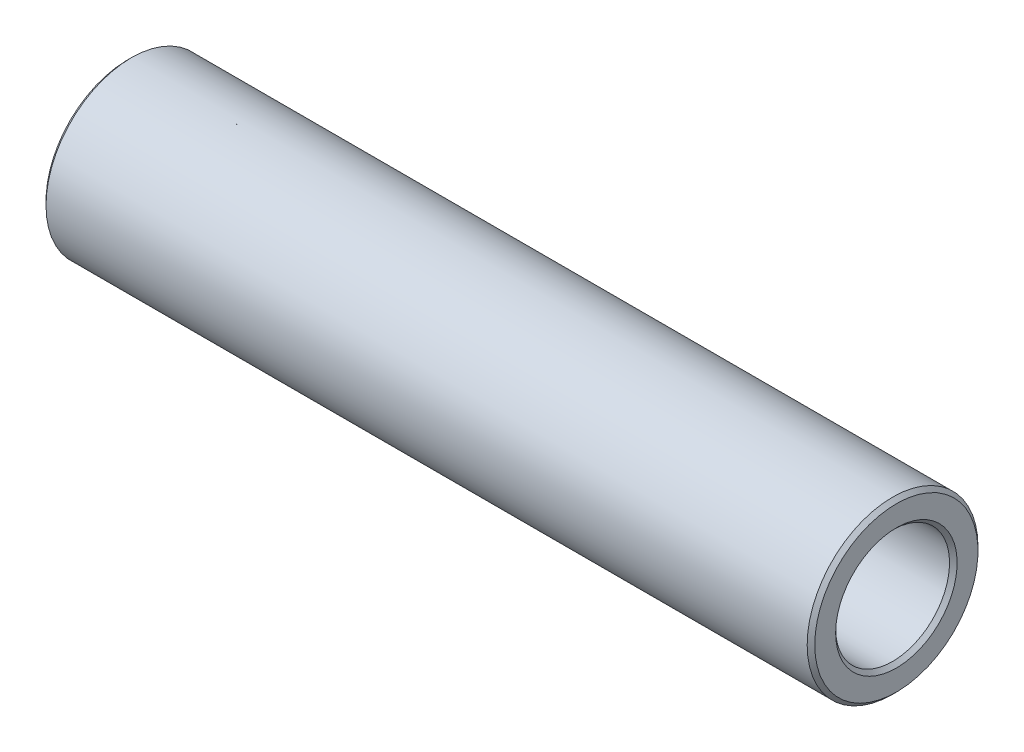
ISO-10303-21;
HEADER;
FILE_DESCRIPTION(('STEP AP214'),'2;1');
FILE_NAME('part.step','',(''),(''),'','','');
FILE_SCHEMA(('AUTOMOTIVE_DESIGN { 1 0 10303 214 1 1 1 1 }'));
ENDSEC;
DATA;
#1=APPLICATION_CONTEXT('core data for automotive mechanical design processes');
#2=APPLICATION_PROTOCOL_DEFINITION('international standard','automotive_design',2000,#1);
#3=PRODUCT_CONTEXT('',#1,'mechanical');
#4=PRODUCT('Part','Part','',(#3));
#5=PRODUCT_RELATED_PRODUCT_CATEGORY('part','',(#4));
#6=PRODUCT_DEFINITION_FORMATION('','',#4);
#7=PRODUCT_DEFINITION_CONTEXT('part definition',#1,'design');
#8=PRODUCT_DEFINITION('design','',#6,#7);
#9=PRODUCT_DEFINITION_SHAPE('','',#8);
#10=(LENGTH_UNIT() NAMED_UNIT(*) SI_UNIT(.MILLI.,.METRE.));
#11=(NAMED_UNIT(*) PLANE_ANGLE_UNIT() SI_UNIT($,.RADIAN.));
#12=(NAMED_UNIT(*) SI_UNIT($,.STERADIAN.) SOLID_ANGLE_UNIT());
#13=UNCERTAINTY_MEASURE_WITH_UNIT(LENGTH_MEASURE(1.E-05),#10,'distance_accuracy_value','');
#14=(GEOMETRIC_REPRESENTATION_CONTEXT(3) GLOBAL_UNCERTAINTY_ASSIGNED_CONTEXT((#13)) GLOBAL_UNIT_ASSIGNED_CONTEXT((#10,
#11,#12)) REPRESENTATION_CONTEXT('',''));
#15=CARTESIAN_POINT('',(0.,0.,0.));
#16=DIRECTION('',(0.,0.,1.));
#17=DIRECTION('',(1.,0.,0.));
#18=AXIS2_PLACEMENT_3D('',#15,#16,#17);
#19=CARTESIAN_POINT('',(0.,3.,0.));
#20=DIRECTION('',(1.,0.,0.));
#21=DIRECTION('',(0.,0.,-1.));
#22=AXIS2_PLACEMENT_3D('',#19,#20,#21);
#23=PLANE('',#22);
#24=CARTESIAN_POINT('',(0.,0.,0.));
#25=DIRECTION('',(1.,0.,0.));
#26=DIRECTION('',(0.,0.,-1.));
#27=AXIS2_PLACEMENT_3D('',#24,#25,#26);
#28=CIRCLE('',#27,3.20000000000001);
#29=CARTESIAN_POINT('',(0.,0.,-3.20000000000001));
#30=VERTEX_POINT('',#29);
#31=EDGE_CURVE('E58',#30,#30,#28,.T.);
#32=ORIENTED_EDGE('',*,*,#31,.T.);
#33=EDGE_LOOP('',(#32));
#34=FACE_BOUND('',#33,.T.);
#35=CARTESIAN_POINT('',(0.,0.,0.));
#36=DIRECTION('',(1.,0.,0.));
#37=DIRECTION('',(0.,0.,-1.));
#38=AXIS2_PLACEMENT_3D('',#35,#36,#37);
#39=CIRCLE('',#38,4.30000000000001);
#40=CARTESIAN_POINT('',(0.,0.,-4.30000000000001));
#41=VERTEX_POINT('',#40);
#42=EDGE_CURVE('E62',#41,#41,#39,.F.);
#43=ORIENTED_EDGE('',*,*,#42,.T.);
#44=EDGE_LOOP('',(#43));
#45=FACE_BOUND('',#44,.T.);
#46=ADVANCED_FACE('F37',(#34,#45),#23,.F.);
#47=CARTESIAN_POINT('',(0.,0.,0.));
#48=DIRECTION('',(-1.,0.,0.));
#49=DIRECTION('',(0.,0.,1.));
#50=AXIS2_PLACEMENT_3D('',#47,#48,#49);
#51=CYLINDRICAL_SURFACE('',#50,4.5);
#52=CARTESIAN_POINT('',(0.200000000000001,0.,0.));
#53=DIRECTION('',(1.,0.,0.));
#54=DIRECTION('',(0.,0.,-1.));
#55=AXIS2_PLACEMENT_3D('',#52,#53,#54);
#56=CIRCLE('',#55,4.5);
#57=CARTESIAN_POINT('',(0.200000000000001,0.,-4.5));
#58=VERTEX_POINT('',#57);
#59=EDGE_CURVE('E48',#58,#58,#56,.T.);
#60=ORIENTED_EDGE('',*,*,#59,.T.);
#61=EDGE_LOOP('',(#60));
#62=FACE_BOUND('',#61,.T.);
#63=CARTESIAN_POINT('',(40.3,0.,0.));
#64=DIRECTION('',(-1.,0.,0.));
#65=DIRECTION('',(0.,0.,1.));
#66=AXIS2_PLACEMENT_3D('',#63,#64,#65);
#67=CIRCLE('',#66,4.5);
#68=CARTESIAN_POINT('',(40.3,0.,4.5));
#69=VERTEX_POINT('',#68);
#70=EDGE_CURVE('E53',#69,#69,#67,.T.);
#71=ORIENTED_EDGE('',*,*,#70,.T.);
#72=EDGE_LOOP('',(#71));
#73=FACE_BOUND('',#72,.T.);
#74=ADVANCED_FACE('F89',(#62,#73),#51,.T.);
#75=CARTESIAN_POINT('',(40.5,3.,0.));
#76=DIRECTION('',(-1.,0.,0.));
#77=DIRECTION('',(0.,0.,1.));
#78=AXIS2_PLACEMENT_3D('',#75,#76,#77);
#79=PLANE('',#78);
#80=CARTESIAN_POINT('',(40.5,0.,0.));
#81=DIRECTION('',(-1.,0.,0.));
#82=DIRECTION('',(0.,0.,1.));
#83=AXIS2_PLACEMENT_3D('',#80,#81,#82);
#84=CIRCLE('',#83,3.19999999999999);
#85=CARTESIAN_POINT('',(40.5,0.,3.19999999999999));
#86=VERTEX_POINT('',#85);
#87=EDGE_CURVE('E10',#86,#86,#84,.T.);
#88=ORIENTED_EDGE('',*,*,#87,.T.);
#89=EDGE_LOOP('',(#88));
#90=FACE_BOUND('',#89,.T.);
#91=CARTESIAN_POINT('',(40.5,0.,0.));
#92=DIRECTION('',(-1.,0.,0.));
#93=DIRECTION('',(0.,0.,1.));
#94=AXIS2_PLACEMENT_3D('',#91,#92,#93);
#95=CIRCLE('',#94,4.30000000000001);
#96=CARTESIAN_POINT('',(40.5,0.,4.30000000000001));
#97=VERTEX_POINT('',#96);
#98=EDGE_CURVE('E44',#97,#97,#95,.F.);
#99=ORIENTED_EDGE('',*,*,#98,.T.);
#100=EDGE_LOOP('',(#99));
#101=FACE_BOUND('',#100,.T.);
#102=ADVANCED_FACE('F95',(#90,#101),#79,.F.);
#103=CARTESIAN_POINT('',(0.,0.,0.));
#104=DIRECTION('',(-1.,0.,0.));
#105=DIRECTION('',(0.,0.,1.));
#106=AXIS2_PLACEMENT_3D('',#103,#104,#105);
#107=CYLINDRICAL_SURFACE('',#106,3.);
#108=CARTESIAN_POINT('',(0.200000000000008,0.,0.));
#109=DIRECTION('',(1.,0.,0.));
#110=DIRECTION('',(0.,0.,-1.));
#111=AXIS2_PLACEMENT_3D('',#108,#109,#110);
#112=CIRCLE('',#111,3.);
#113=CARTESIAN_POINT('',(0.200000000000008,0.,-3.));
#114=VERTEX_POINT('',#113);
#115=EDGE_CURVE('E66',#114,#114,#112,.F.);
#116=ORIENTED_EDGE('',*,*,#115,.T.);
#117=EDGE_LOOP('',(#116));
#118=FACE_BOUND('',#117,.T.);
#119=CARTESIAN_POINT('',(40.3,0.,0.));
#120=DIRECTION('',(-1.,0.,0.));
#121=DIRECTION('',(0.,0.,1.));
#122=AXIS2_PLACEMENT_3D('',#119,#120,#121);
#123=CIRCLE('',#122,3.);
#124=CARTESIAN_POINT('',(40.3,0.,3.));
#125=VERTEX_POINT('',#124);
#126=EDGE_CURVE('E70',#125,#125,#123,.F.);
#127=ORIENTED_EDGE('',*,*,#126,.T.);
#128=EDGE_LOOP('',(#127));
#129=FACE_BOUND('',#128,.T.);
#130=ADVANCED_FACE('F74',(#118,#129),#107,.F.);
#131=CARTESIAN_POINT('',(0.200000000000008,0.,0.));
#132=DIRECTION('',(-1.,0.,0.));
#133=DIRECTION('',(0.,0.,1.));
#134=AXIS2_PLACEMENT_3D('',#131,#132,#133);
#135=CONICAL_SURFACE('',#134,3.,0.785398163397441);
#136=ORIENTED_EDGE('',*,*,#31,.F.);
#137=EDGE_LOOP('',(#136));
#138=FACE_BOUND('',#137,.T.);
#139=ORIENTED_EDGE('',*,*,#115,.F.);
#140=EDGE_LOOP('',(#139));
#141=FACE_BOUND('',#140,.T.);
#142=ADVANCED_FACE('F85',(#138,#141),#135,.F.);
#143=CARTESIAN_POINT('',(0.,0.,0.));
#144=DIRECTION('',(1.,0.,0.));
#145=DIRECTION('',(0.,0.,-1.));
#146=AXIS2_PLACEMENT_3D('',#143,#144,#145);
#147=CONICAL_SURFACE('',#146,4.30000000000001,0.785398163397431);
#148=ORIENTED_EDGE('',*,*,#59,.F.);
#149=EDGE_LOOP('',(#148));
#150=FACE_BOUND('',#149,.T.);
#151=ORIENTED_EDGE('',*,*,#42,.F.);
#152=EDGE_LOOP('',(#151));
#153=FACE_BOUND('',#152,.T.);
#154=ADVANCED_FACE('F79',(#150,#153),#147,.T.);
#155=CARTESIAN_POINT('',(40.5,0.,0.));
#156=DIRECTION('',(1.,0.,0.));
#157=DIRECTION('',(0.,0.,-1.));
#158=AXIS2_PLACEMENT_3D('',#155,#156,#157);
#159=CONICAL_SURFACE('',#158,3.19999999999999,0.785398163397446);
#160=ORIENTED_EDGE('',*,*,#126,.F.);
#161=EDGE_LOOP('',(#160));
#162=FACE_BOUND('',#161,.T.);
#163=ORIENTED_EDGE('',*,*,#87,.F.);
#164=EDGE_LOOP('',(#163));
#165=FACE_BOUND('',#164,.T.);
#166=ADVANCED_FACE('F76',(#162,#165),#159,.F.);
#167=CARTESIAN_POINT('',(40.3,0.,0.));
#168=DIRECTION('',(-1.,0.,0.));
#169=DIRECTION('',(0.,0.,1.));
#170=AXIS2_PLACEMENT_3D('',#167,#168,#169);
#171=CONICAL_SURFACE('',#170,4.5,0.785398163397438);
#172=ORIENTED_EDGE('',*,*,#98,.F.);
#173=EDGE_LOOP('',(#172));
#174=FACE_BOUND('',#173,.T.);
#175=ORIENTED_EDGE('',*,*,#70,.F.);
#176=EDGE_LOOP('',(#175));
#177=FACE_BOUND('',#176,.T.);
#178=ADVANCED_FACE('F39',(#174,#177),#171,.T.);
#179=CLOSED_SHELL('',(#46,#74,#102,#130,#142,#154,#166,#178));
#180=MANIFOLD_SOLID_BREP('B2',#179);
#181=ADVANCED_BREP_SHAPE_REPRESENTATION('',(#18,#180),#14);
#182=SHAPE_DEFINITION_REPRESENTATION(#9,#181);
ENDSEC;
END-ISO-10303-21;
